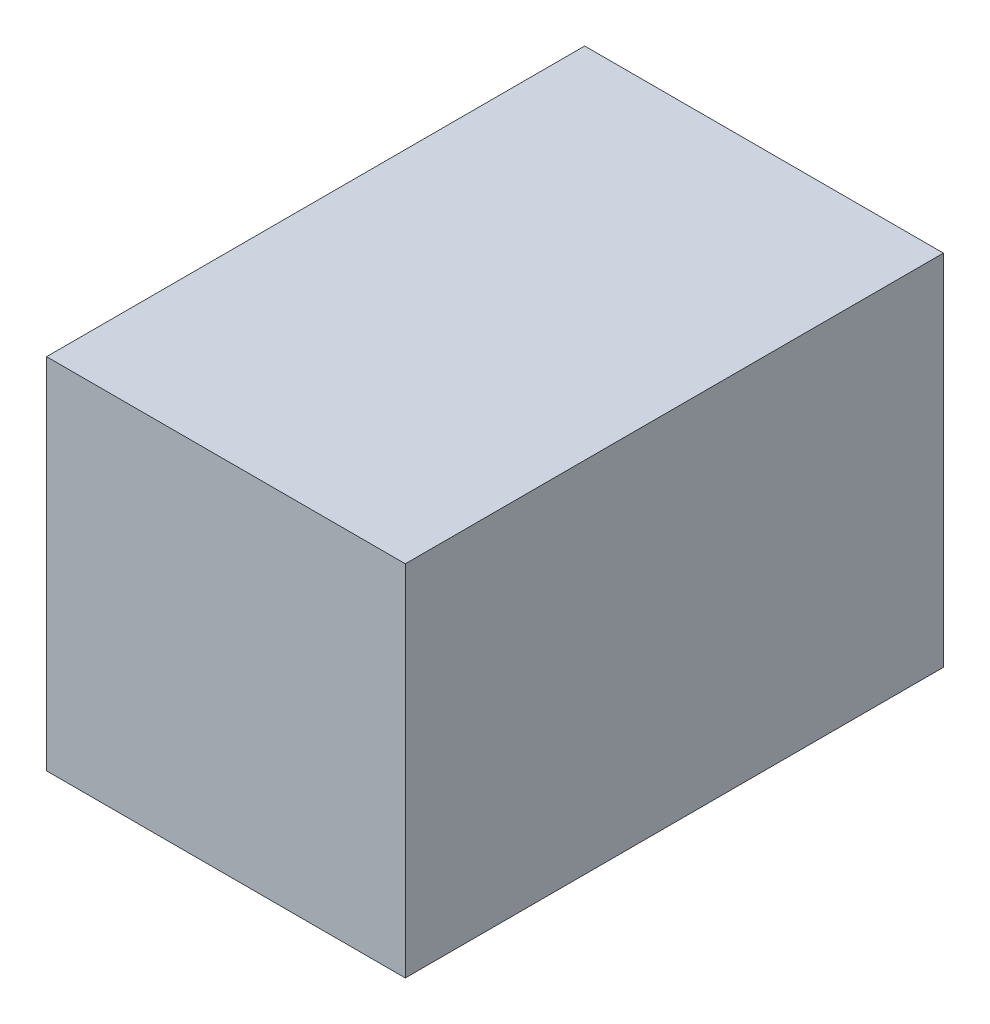
ISO-10303-21;
HEADER;
FILE_DESCRIPTION(('STEP AP214'),'2;1');
FILE_NAME('part.step','',(''),(''),'','','');
FILE_SCHEMA(('AUTOMOTIVE_DESIGN { 1 0 10303 214 1 1 1 1 }'));
ENDSEC;
DATA;
#1=APPLICATION_CONTEXT('core data for automotive mechanical design processes');
#2=APPLICATION_PROTOCOL_DEFINITION('international standard','automotive_design',2000,#1);
#3=PRODUCT_CONTEXT('',#1,'mechanical');
#4=PRODUCT('Part','Part','',(#3));
#5=PRODUCT_RELATED_PRODUCT_CATEGORY('part','',(#4));
#6=PRODUCT_DEFINITION_FORMATION('','',#4);
#7=PRODUCT_DEFINITION_CONTEXT('part definition',#1,'design');
#8=PRODUCT_DEFINITION('design','',#6,#7);
#9=PRODUCT_DEFINITION_SHAPE('','',#8);
#10=(LENGTH_UNIT() NAMED_UNIT(*) SI_UNIT(.MILLI.,.METRE.));
#11=(NAMED_UNIT(*) PLANE_ANGLE_UNIT() SI_UNIT($,.RADIAN.));
#12=(NAMED_UNIT(*) SI_UNIT($,.STERADIAN.) SOLID_ANGLE_UNIT());
#13=UNCERTAINTY_MEASURE_WITH_UNIT(LENGTH_MEASURE(1.E-05),#10,'distance_accuracy_value','');
#14=(GEOMETRIC_REPRESENTATION_CONTEXT(3) GLOBAL_UNCERTAINTY_ASSIGNED_CONTEXT((#13)) GLOBAL_UNIT_ASSIGNED_CONTEXT((#10,
#11,#12)) REPRESENTATION_CONTEXT('',''));
#15=CARTESIAN_POINT('',(0.,0.,0.));
#16=DIRECTION('',(0.,0.,1.));
#17=DIRECTION('',(1.,0.,0.));
#18=AXIS2_PLACEMENT_3D('',#15,#16,#17);
#19=CARTESIAN_POINT('',(6.35,12.7,-9.525));
#20=DIRECTION('',(-1.,0.,0.));
#21=DIRECTION('',(0.,0.,1.));
#22=AXIS2_PLACEMENT_3D('',#19,#20,#21);
#23=PLANE('',#22);
#24=DIRECTION('',(0.,0.,-1.));
#25=VECTOR('',#24,1.);
#26=CARTESIAN_POINT('',(6.35,0.,-9.525));
#27=LINE('',#26,#25);
#28=CARTESIAN_POINT('',(6.35,0.,9.525));
#29=VERTEX_POINT('',#28);
#30=CARTESIAN_POINT('',(6.35,0.,-9.525));
#31=VERTEX_POINT('',#30);
#32=EDGE_CURVE('E97',#29,#31,#27,.T.);
#33=ORIENTED_EDGE('',*,*,#32,.T.);
#34=DIRECTION('',(0.,-1.,0.));
#35=VECTOR('',#34,1.);
#36=CARTESIAN_POINT('',(6.35,12.7,-9.525));
#37=LINE('',#36,#35);
#38=CARTESIAN_POINT('',(6.35,12.7,-9.525));
#39=VERTEX_POINT('',#38);
#40=EDGE_CURVE('E11',#39,#31,#37,.T.);
#41=ORIENTED_EDGE('',*,*,#40,.F.);
#42=DIRECTION('',(0.,0.,-1.));
#43=VECTOR('',#42,1.);
#44=CARTESIAN_POINT('',(6.35,12.7,-9.525));
#45=LINE('',#44,#43);
#46=CARTESIAN_POINT('',(6.35,12.7,9.525));
#47=VERTEX_POINT('',#46);
#48=EDGE_CURVE('E85',#47,#39,#45,.T.);
#49=ORIENTED_EDGE('',*,*,#48,.F.);
#50=DIRECTION('',(0.,-1.,0.));
#51=VECTOR('',#50,1.);
#52=CARTESIAN_POINT('',(6.35,12.7,9.525));
#53=LINE('',#52,#51);
#54=EDGE_CURVE('E93',#47,#29,#53,.T.);
#55=ORIENTED_EDGE('',*,*,#54,.T.);
#56=EDGE_LOOP('',(#33,#41,#49,#55));
#57=FACE_BOUND('',#56,.T.);
#58=ADVANCED_FACE('F34',(#57),#23,.F.);
#59=CARTESIAN_POINT('',(-6.35,12.7,-9.525));
#60=DIRECTION('',(0.,0.,1.));
#61=DIRECTION('',(1.,0.,0.));
#62=AXIS2_PLACEMENT_3D('',#59,#60,#61);
#63=PLANE('',#62);
#64=DIRECTION('',(-1.,0.,0.));
#65=VECTOR('',#64,1.);
#66=CARTESIAN_POINT('',(-6.35,0.,-9.525));
#67=LINE('',#66,#65);
#68=CARTESIAN_POINT('',(-6.35,0.,-9.525));
#69=VERTEX_POINT('',#68);
#70=EDGE_CURVE('E89',#31,#69,#67,.T.);
#71=ORIENTED_EDGE('',*,*,#70,.T.);
#72=DIRECTION('',(0.,-1.,0.));
#73=VECTOR('',#72,1.);
#74=CARTESIAN_POINT('',(-6.35,12.7,-9.525));
#75=LINE('',#74,#73);
#76=CARTESIAN_POINT('',(-6.35,12.7,-9.525));
#77=VERTEX_POINT('',#76);
#78=EDGE_CURVE('E42',#77,#69,#75,.T.);
#79=ORIENTED_EDGE('',*,*,#78,.F.);
#80=DIRECTION('',(-1.,0.,0.));
#81=VECTOR('',#80,1.);
#82=CARTESIAN_POINT('',(-6.35,12.7,-9.525));
#83=LINE('',#82,#81);
#84=EDGE_CURVE('E80',#39,#77,#83,.T.);
#85=ORIENTED_EDGE('',*,*,#84,.F.);
#86=ORIENTED_EDGE('',*,*,#40,.T.);
#87=EDGE_LOOP('',(#71,#79,#85,#86));
#88=FACE_BOUND('',#87,.T.);
#89=ADVANCED_FACE('F88',(#88),#63,.F.);
#90=CARTESIAN_POINT('',(-6.35,12.7,-9.525));
#91=DIRECTION('',(1.,0.,0.));
#92=DIRECTION('',(0.,0.,-1.));
#93=AXIS2_PLACEMENT_3D('',#90,#91,#92);
#94=PLANE('',#93);
#95=DIRECTION('',(0.,0.,1.));
#96=VECTOR('',#95,1.);
#97=CARTESIAN_POINT('',(-6.35,0.,-9.525));
#98=LINE('',#97,#96);
#99=CARTESIAN_POINT('',(-6.35,0.,9.525));
#100=VERTEX_POINT('',#99);
#101=EDGE_CURVE('E67',#69,#100,#98,.T.);
#102=ORIENTED_EDGE('',*,*,#101,.T.);
#103=DIRECTION('',(0.,-1.,0.));
#104=VECTOR('',#103,1.);
#105=CARTESIAN_POINT('',(-6.35,12.7,9.525));
#106=LINE('',#105,#104);
#107=CARTESIAN_POINT('',(-6.35,12.7,9.525));
#108=VERTEX_POINT('',#107);
#109=EDGE_CURVE('E90',#108,#100,#106,.T.);
#110=ORIENTED_EDGE('',*,*,#109,.F.);
#111=DIRECTION('',(0.,0.,1.));
#112=VECTOR('',#111,1.);
#113=CARTESIAN_POINT('',(-6.35,12.7,-9.525));
#114=LINE('',#113,#112);
#115=EDGE_CURVE('E83',#77,#108,#114,.T.);
#116=ORIENTED_EDGE('',*,*,#115,.F.);
#117=ORIENTED_EDGE('',*,*,#78,.T.);
#118=EDGE_LOOP('',(#102,#110,#116,#117));
#119=FACE_BOUND('',#118,.T.);
#120=ADVANCED_FACE('F91',(#119),#94,.F.);
#121=CARTESIAN_POINT('',(-6.35,12.7,9.525));
#122=DIRECTION('',(0.,0.,-1.));
#123=DIRECTION('',(-1.,0.,0.));
#124=AXIS2_PLACEMENT_3D('',#121,#122,#123);
#125=PLANE('',#124);
#126=DIRECTION('',(1.,0.,0.));
#127=VECTOR('',#126,1.);
#128=CARTESIAN_POINT('',(-6.35,0.,9.525));
#129=LINE('',#128,#127);
#130=EDGE_CURVE('E73',#100,#29,#129,.T.);
#131=ORIENTED_EDGE('',*,*,#130,.T.);
#132=ORIENTED_EDGE('',*,*,#54,.F.);
#133=DIRECTION('',(1.,0.,0.));
#134=VECTOR('',#133,1.);
#135=CARTESIAN_POINT('',(-6.35,12.7,9.525));
#136=LINE('',#135,#134);
#137=EDGE_CURVE('E50',#108,#47,#136,.T.);
#138=ORIENTED_EDGE('',*,*,#137,.F.);
#139=ORIENTED_EDGE('',*,*,#109,.T.);
#140=EDGE_LOOP('',(#131,#132,#138,#139));
#141=FACE_BOUND('',#140,.T.);
#142=ADVANCED_FACE('F104',(#141),#125,.F.);
#143=CARTESIAN_POINT('',(0.,12.7,0.));
#144=DIRECTION('',(0.,1.,0.));
#145=DIRECTION('',(0.,0.,1.));
#146=AXIS2_PLACEMENT_3D('',#143,#144,#145);
#147=PLANE('',#146);
#148=ORIENTED_EDGE('',*,*,#48,.T.);
#149=ORIENTED_EDGE('',*,*,#84,.T.);
#150=ORIENTED_EDGE('',*,*,#115,.T.);
#151=ORIENTED_EDGE('',*,*,#137,.T.);
#152=EDGE_LOOP('',(#148,#149,#150,#151));
#153=FACE_BOUND('',#152,.T.);
#154=ADVANCED_FACE('F81',(#153),#147,.T.);
#155=CARTESIAN_POINT('',(0.,0.,0.));
#156=DIRECTION('',(0.,1.,0.));
#157=DIRECTION('',(0.,0.,1.));
#158=AXIS2_PLACEMENT_3D('',#155,#156,#157);
#159=PLANE('',#158);
#160=ORIENTED_EDGE('',*,*,#32,.F.);
#161=ORIENTED_EDGE('',*,*,#130,.F.);
#162=ORIENTED_EDGE('',*,*,#101,.F.);
#163=ORIENTED_EDGE('',*,*,#70,.F.);
#164=EDGE_LOOP('',(#160,#161,#162,#163));
#165=FACE_BOUND('',#164,.T.);
#166=ADVANCED_FACE('F107',(#165),#159,.F.);
#167=CLOSED_SHELL('',(#58,#89,#120,#142,#154,#166));
#168=MANIFOLD_SOLID_BREP('B2',#167);
#169=ADVANCED_BREP_SHAPE_REPRESENTATION('',(#18,#168),#14);
#170=SHAPE_DEFINITION_REPRESENTATION(#9,#169);
ENDSEC;
END-ISO-10303-21;
